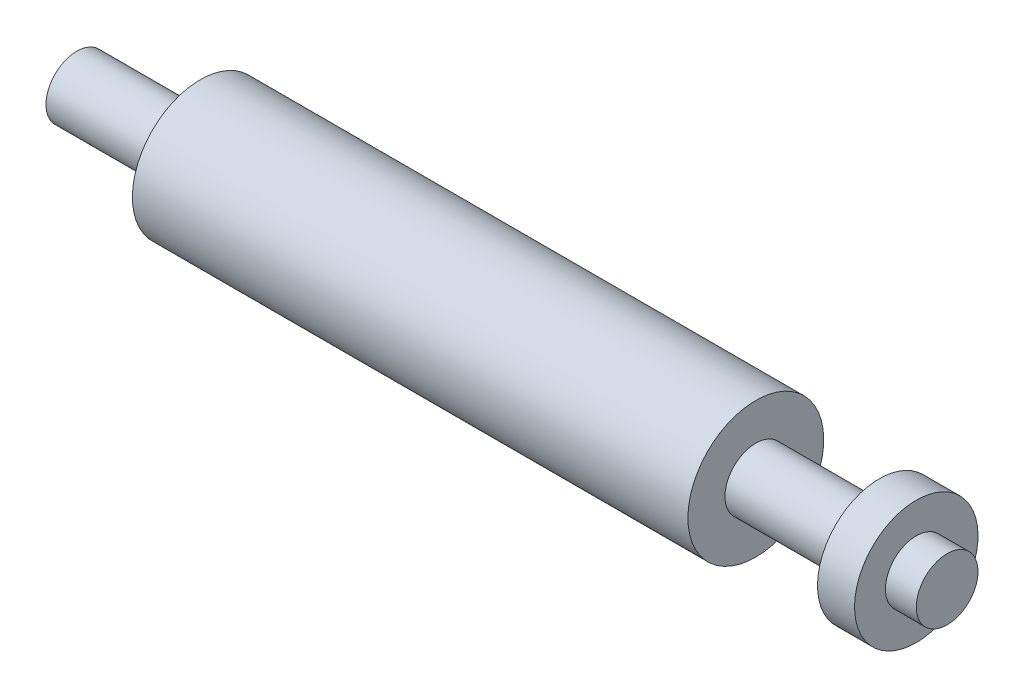
ISO-10303-21;
HEADER;
FILE_DESCRIPTION(('STEP AP214'),'2;1');
FILE_NAME('part.step','',(''),(''),'','','');
FILE_SCHEMA(('AUTOMOTIVE_DESIGN { 1 0 10303 214 1 1 1 1 }'));
ENDSEC;
DATA;
#1=APPLICATION_CONTEXT('core data for automotive mechanical design processes');
#2=APPLICATION_PROTOCOL_DEFINITION('international standard','automotive_design',2000,#1);
#3=PRODUCT_CONTEXT('',#1,'mechanical');
#4=PRODUCT('Part','Part','',(#3));
#5=PRODUCT_RELATED_PRODUCT_CATEGORY('part','',(#4));
#6=PRODUCT_DEFINITION_FORMATION('','',#4);
#7=PRODUCT_DEFINITION_CONTEXT('part definition',#1,'design');
#8=PRODUCT_DEFINITION('design','',#6,#7);
#9=PRODUCT_DEFINITION_SHAPE('','',#8);
#10=(LENGTH_UNIT() NAMED_UNIT(*) SI_UNIT(.MILLI.,.METRE.));
#11=(NAMED_UNIT(*) PLANE_ANGLE_UNIT() SI_UNIT($,.RADIAN.));
#12=(NAMED_UNIT(*) SI_UNIT($,.STERADIAN.) SOLID_ANGLE_UNIT());
#13=UNCERTAINTY_MEASURE_WITH_UNIT(LENGTH_MEASURE(1.E-05),#10,'distance_accuracy_value','');
#14=(GEOMETRIC_REPRESENTATION_CONTEXT(3) GLOBAL_UNCERTAINTY_ASSIGNED_CONTEXT((#13)) GLOBAL_UNIT_ASSIGNED_CONTEXT((#10,
#11,#12)) REPRESENTATION_CONTEXT('',''));
#15=CARTESIAN_POINT('',(0.,0.,0.));
#16=DIRECTION('',(0.,0.,1.));
#17=DIRECTION('',(1.,0.,0.));
#18=AXIS2_PLACEMENT_3D('',#15,#16,#17);
#19=CARTESIAN_POINT('',(-330.074626865672,0.,0.));
#20=DIRECTION('',(-1.,0.,0.));
#21=DIRECTION('',(0.,-1.,0.));
#22=AXIS2_PLACEMENT_3D('',#19,#20,#21);
#23=CYLINDRICAL_SURFACE('',#22,25.);
#24=CARTESIAN_POINT('',(-330.074626865672,0.,0.));
#25=DIRECTION('',(-1.,0.,0.));
#26=DIRECTION('',(0.,-1.,0.));
#27=AXIS2_PLACEMENT_3D('',#24,#25,#26);
#28=CIRCLE('',#27,25.);
#29=CARTESIAN_POINT('',(-330.074626865672,-25.,0.));
#30=VERTEX_POINT('',#29);
#31=EDGE_CURVE('E10',#30,#30,#28,.T.);
#32=ORIENTED_EDGE('',*,*,#31,.F.);
#33=EDGE_LOOP('',(#32));
#34=FACE_BOUND('',#33,.T.);
#35=CARTESIAN_POINT('',(-230.074626865672,0.,0.));
#36=DIRECTION('',(-1.,0.,0.));
#37=DIRECTION('',(0.,-1.,0.));
#38=AXIS2_PLACEMENT_3D('',#35,#36,#37);
#39=CIRCLE('',#38,25.);
#40=CARTESIAN_POINT('',(-230.074626865672,-25.,0.));
#41=VERTEX_POINT('',#40);
#42=EDGE_CURVE('E88',#41,#41,#39,.T.);
#43=ORIENTED_EDGE('',*,*,#42,.T.);
#44=EDGE_LOOP('',(#43));
#45=FACE_BOUND('',#44,.T.);
#46=ADVANCED_FACE('F45',(#34,#45),#23,.T.);
#47=CARTESIAN_POINT('',(-330.074626865672,-7.32912901181652E-13,0.));
#48=DIRECTION('',(1.,0.,0.));
#49=DIRECTION('',(0.,1.,0.));
#50=AXIS2_PLACEMENT_3D('',#47,#48,#49);
#51=PLANE('',#50);
#52=ORIENTED_EDGE('',*,*,#31,.T.);
#53=EDGE_LOOP('',(#52));
#54=FACE_BOUND('',#53,.T.);
#55=ADVANCED_FACE('F143',(#54),#51,.F.);
#56=CARTESIAN_POINT('',(374.925373134328,0.,0.));
#57=DIRECTION('',(1.,0.,0.));
#58=DIRECTION('',(0.,1.,0.));
#59=AXIS2_PLACEMENT_3D('',#56,#57,#58);
#60=PLANE('',#59);
#61=CARTESIAN_POINT('',(374.925373134328,0.,0.));
#62=DIRECTION('',(-1.,0.,0.));
#63=DIRECTION('',(0.,-1.,0.));
#64=AXIS2_PLACEMENT_3D('',#61,#62,#63);
#65=CIRCLE('',#64,25.0000000000001);
#66=CARTESIAN_POINT('',(374.925373134328,-25.,0.));
#67=VERTEX_POINT('',#66);
#68=EDGE_CURVE('E52',#67,#67,#65,.T.);
#69=ORIENTED_EDGE('',*,*,#68,.F.);
#70=EDGE_LOOP('',(#69));
#71=FACE_BOUND('',#70,.T.);
#72=ADVANCED_FACE('F138',(#71),#60,.T.);
#73=CARTESIAN_POINT('',(-330.074626865672,0.,0.));
#74=DIRECTION('',(-1.,0.,0.));
#75=DIRECTION('',(0.,-1.,0.));
#76=AXIS2_PLACEMENT_3D('',#73,#74,#75);
#77=CYLINDRICAL_SURFACE('',#76,25.0000000000001);
#78=ORIENTED_EDGE('',*,*,#68,.T.);
#79=EDGE_LOOP('',(#78));
#80=FACE_BOUND('',#79,.T.);
#81=CARTESIAN_POINT('',(349.925373134328,0.,0.));
#82=DIRECTION('',(-1.,0.,0.));
#83=DIRECTION('',(0.,-1.,0.));
#84=AXIS2_PLACEMENT_3D('',#81,#82,#83);
#85=CIRCLE('',#84,25.);
#86=CARTESIAN_POINT('',(349.925373134328,-25.,0.));
#87=VERTEX_POINT('',#86);
#88=EDGE_CURVE('E57',#87,#87,#85,.T.);
#89=ORIENTED_EDGE('',*,*,#88,.F.);
#90=EDGE_LOOP('',(#89));
#91=FACE_BOUND('',#90,.T.);
#92=ADVANCED_FACE('F133',(#80,#91),#77,.T.);
#93=CARTESIAN_POINT('',(349.925373134328,0.,0.));
#94=DIRECTION('',(-1.,0.,0.));
#95=DIRECTION('',(0.,-1.,0.));
#96=AXIS2_PLACEMENT_3D('',#93,#94,#95);
#97=PLANE('',#96);
#98=CARTESIAN_POINT('',(349.925373134328,0.,0.));
#99=DIRECTION('',(-1.,0.,0.));
#100=DIRECTION('',(0.,-1.,0.));
#101=AXIS2_PLACEMENT_3D('',#98,#99,#100);
#102=CIRCLE('',#101,50.);
#103=CARTESIAN_POINT('',(349.925373134328,-49.9999999999999,0.));
#104=VERTEX_POINT('',#103);
#105=EDGE_CURVE('E62',#104,#104,#102,.T.);
#106=ORIENTED_EDGE('',*,*,#105,.F.);
#107=EDGE_LOOP('',(#106));
#108=FACE_BOUND('',#107,.T.);
#109=ORIENTED_EDGE('',*,*,#88,.T.);
#110=EDGE_LOOP('',(#109));
#111=FACE_BOUND('',#110,.T.);
#112=ADVANCED_FACE('F127',(#108,#111),#97,.F.);
#113=CARTESIAN_POINT('',(-330.074626865672,0.,0.));
#114=DIRECTION('',(-1.,0.,0.));
#115=DIRECTION('',(0.,-1.,0.));
#116=AXIS2_PLACEMENT_3D('',#113,#114,#115);
#117=CYLINDRICAL_SURFACE('',#116,50.);
#118=CARTESIAN_POINT('',(319.925373134328,0.,0.));
#119=DIRECTION('',(-1.,0.,0.));
#120=DIRECTION('',(0.,-1.,0.));
#121=AXIS2_PLACEMENT_3D('',#118,#119,#120);
#122=CIRCLE('',#121,50.);
#123=CARTESIAN_POINT('',(319.925373134328,-49.9999999999999,0.));
#124=VERTEX_POINT('',#123);
#125=EDGE_CURVE('E68',#124,#124,#122,.T.);
#126=ORIENTED_EDGE('',*,*,#125,.F.);
#127=EDGE_LOOP('',(#126));
#128=FACE_BOUND('',#127,.T.);
#129=ORIENTED_EDGE('',*,*,#105,.T.);
#130=EDGE_LOOP('',(#129));
#131=FACE_BOUND('',#130,.T.);
#132=ADVANCED_FACE('F121',(#128,#131),#117,.T.);
#133=CARTESIAN_POINT('',(319.925373134328,-7.10377030831054E-13,0.));
#134=DIRECTION('',(1.,0.,0.));
#135=DIRECTION('',(0.,1.,0.));
#136=AXIS2_PLACEMENT_3D('',#133,#134,#135);
#137=PLANE('',#136);
#138=CARTESIAN_POINT('',(319.925373134328,0.,0.));
#139=DIRECTION('',(-1.,0.,0.));
#140=DIRECTION('',(0.,-1.,0.));
#141=AXIS2_PLACEMENT_3D('',#138,#139,#140);
#142=CIRCLE('',#141,25.0000000000001);
#143=CARTESIAN_POINT('',(319.925373134328,-25.,0.));
#144=VERTEX_POINT('',#143);
#145=EDGE_CURVE('E72',#144,#144,#142,.T.);
#146=ORIENTED_EDGE('',*,*,#145,.F.);
#147=EDGE_LOOP('',(#146));
#148=FACE_BOUND('',#147,.T.);
#149=ORIENTED_EDGE('',*,*,#125,.T.);
#150=EDGE_LOOP('',(#149));
#151=FACE_BOUND('',#150,.T.);
#152=ADVANCED_FACE('F115',(#148,#151),#137,.F.);
#153=CARTESIAN_POINT('',(-330.074626865672,0.,0.));
#154=DIRECTION('',(-1.,0.,0.));
#155=DIRECTION('',(0.,-1.,0.));
#156=AXIS2_PLACEMENT_3D('',#153,#154,#155);
#157=CYLINDRICAL_SURFACE('',#156,25.0000000000001);
#158=CARTESIAN_POINT('',(219.925373134328,0.,0.));
#159=DIRECTION('',(-1.,0.,0.));
#160=DIRECTION('',(0.,-1.,0.));
#161=AXIS2_PLACEMENT_3D('',#158,#159,#160);
#162=CIRCLE('',#161,25.0000000000001);
#163=CARTESIAN_POINT('',(219.925373134328,-25.,0.));
#164=VERTEX_POINT('',#163);
#165=EDGE_CURVE('E76',#164,#164,#162,.T.);
#166=ORIENTED_EDGE('',*,*,#165,.F.);
#167=EDGE_LOOP('',(#166));
#168=FACE_BOUND('',#167,.T.);
#169=ORIENTED_EDGE('',*,*,#145,.T.);
#170=EDGE_LOOP('',(#169));
#171=FACE_BOUND('',#170,.T.);
#172=ADVANCED_FACE('F109',(#168,#171),#157,.T.);
#173=CARTESIAN_POINT('',(219.925373134328,0.,0.));
#174=DIRECTION('',(-1.,0.,0.));
#175=DIRECTION('',(0.,-1.,0.));
#176=AXIS2_PLACEMENT_3D('',#173,#174,#175);
#177=PLANE('',#176);
#178=CARTESIAN_POINT('',(219.925373134328,0.,0.));
#179=DIRECTION('',(-1.,0.,0.));
#180=DIRECTION('',(0.,-1.,0.));
#181=AXIS2_PLACEMENT_3D('',#178,#179,#180);
#182=CIRCLE('',#181,55.0000000000001);
#183=CARTESIAN_POINT('',(219.925373134328,-55.,0.));
#184=VERTEX_POINT('',#183);
#185=EDGE_CURVE('E80',#184,#184,#182,.T.);
#186=ORIENTED_EDGE('',*,*,#185,.F.);
#187=EDGE_LOOP('',(#186));
#188=FACE_BOUND('',#187,.T.);
#189=ORIENTED_EDGE('',*,*,#165,.T.);
#190=EDGE_LOOP('',(#189));
#191=FACE_BOUND('',#190,.T.);
#192=ADVANCED_FACE('F103',(#188,#191),#177,.F.);
#193=CARTESIAN_POINT('',(-330.074626865672,0.,0.));
#194=DIRECTION('',(-1.,0.,0.));
#195=DIRECTION('',(0.,-1.,0.));
#196=AXIS2_PLACEMENT_3D('',#193,#194,#195);
#197=CYLINDRICAL_SURFACE('',#196,55.);
#198=CARTESIAN_POINT('',(-230.074626865672,0.,0.));
#199=DIRECTION('',(-1.,0.,0.));
#200=DIRECTION('',(0.,-1.,0.));
#201=AXIS2_PLACEMENT_3D('',#198,#199,#200);
#202=CIRCLE('',#201,55.);
#203=CARTESIAN_POINT('',(-230.074626865672,-55.,0.));
#204=VERTEX_POINT('',#203);
#205=EDGE_CURVE('E84',#204,#204,#202,.T.);
#206=ORIENTED_EDGE('',*,*,#205,.F.);
#207=EDGE_LOOP('',(#206));
#208=FACE_BOUND('',#207,.T.);
#209=ORIENTED_EDGE('',*,*,#185,.T.);
#210=EDGE_LOOP('',(#209));
#211=FACE_BOUND('',#210,.T.);
#212=ADVANCED_FACE('F97',(#208,#211),#197,.T.);
#213=CARTESIAN_POINT('',(-230.074626865672,0.,0.));
#214=DIRECTION('',(1.,0.,0.));
#215=DIRECTION('',(0.,1.,0.));
#216=AXIS2_PLACEMENT_3D('',#213,#214,#215);
#217=PLANE('',#216);
#218=ORIENTED_EDGE('',*,*,#42,.F.);
#219=EDGE_LOOP('',(#218));
#220=FACE_BOUND('',#219,.T.);
#221=ORIENTED_EDGE('',*,*,#205,.T.);
#222=EDGE_LOOP('',(#221));
#223=FACE_BOUND('',#222,.T.);
#224=ADVANCED_FACE('F94',(#220,#223),#217,.F.);
#225=CLOSED_SHELL('',(#46,#55,#72,#92,#112,#132,#152,#172,#192,#212,#224));
#226=MANIFOLD_SOLID_BREP('B2',#225);
#227=ADVANCED_BREP_SHAPE_REPRESENTATION('',(#18,#226),#14);
#228=SHAPE_DEFINITION_REPRESENTATION(#9,#227);
ENDSEC;
END-ISO-10303-21;
